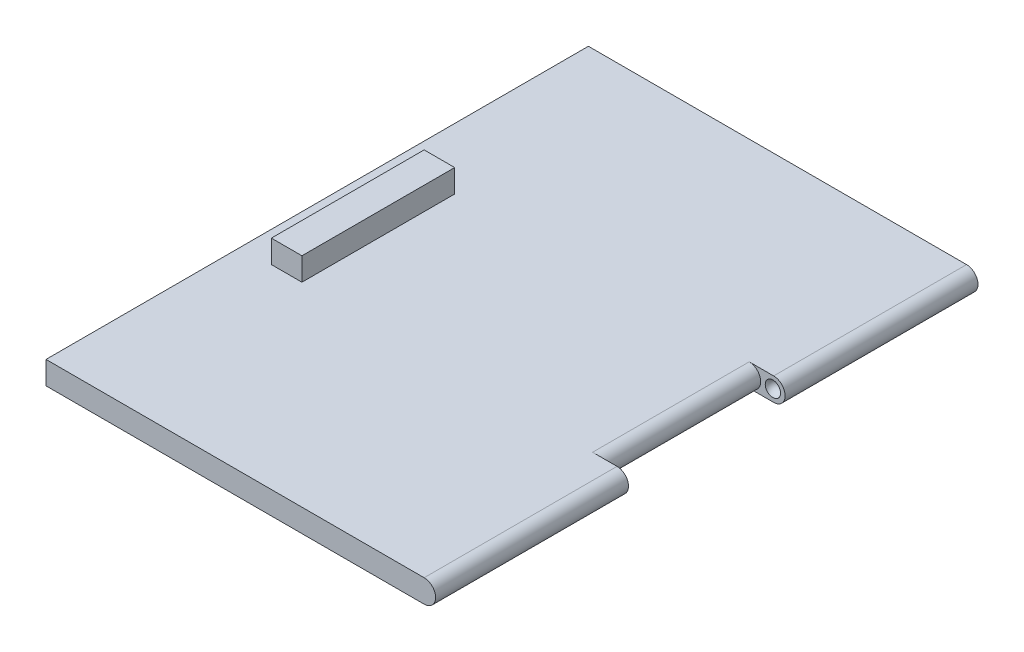
ISO-10303-21;
HEADER;
FILE_DESCRIPTION(('STEP AP214'),'2;1');
FILE_NAME('part.step','',(''),(''),'','','');
FILE_SCHEMA(('AUTOMOTIVE_DESIGN { 1 0 10303 214 1 1 1 1 }'));
ENDSEC;
DATA;
#1=APPLICATION_CONTEXT('core data for automotive mechanical design processes');
#2=APPLICATION_PROTOCOL_DEFINITION('international standard','automotive_design',2000,#1);
#3=PRODUCT_CONTEXT('',#1,'mechanical');
#4=PRODUCT('Part','Part','',(#3));
#5=PRODUCT_RELATED_PRODUCT_CATEGORY('part','',(#4));
#6=PRODUCT_DEFINITION_FORMATION('','',#4);
#7=PRODUCT_DEFINITION_CONTEXT('part definition',#1,'design');
#8=PRODUCT_DEFINITION('design','',#6,#7);
#9=PRODUCT_DEFINITION_SHAPE('','',#8);
#10=(LENGTH_UNIT() NAMED_UNIT(*) SI_UNIT(.MILLI.,.METRE.));
#11=(NAMED_UNIT(*) PLANE_ANGLE_UNIT() SI_UNIT($,.RADIAN.));
#12=(NAMED_UNIT(*) SI_UNIT($,.STERADIAN.) SOLID_ANGLE_UNIT());
#13=UNCERTAINTY_MEASURE_WITH_UNIT(LENGTH_MEASURE(1.E-05),#10,'distance_accuracy_value','');
#14=(GEOMETRIC_REPRESENTATION_CONTEXT(3) GLOBAL_UNCERTAINTY_ASSIGNED_CONTEXT((#13)) GLOBAL_UNIT_ASSIGNED_CONTEXT((#10,
#11,#12)) REPRESENTATION_CONTEXT('',''));
#15=CARTESIAN_POINT('',(0.,0.,0.));
#16=DIRECTION('',(0.,0.,1.));
#17=DIRECTION('',(1.,0.,0.));
#18=AXIS2_PLACEMENT_3D('',#15,#16,#17);
#19=CARTESIAN_POINT('',(24.,1.5,-10.25));
#20=DIRECTION('',(0.,0.,-1.));
#21=DIRECTION('',(-1.,0.,0.));
#22=AXIS2_PLACEMENT_3D('',#19,#20,#21);
#23=CYLINDRICAL_SURFACE('',#22,1.5);
#24=DIRECTION('',(0.,0.,1.));
#25=VECTOR('',#24,1.);
#26=CARTESIAN_POINT('',(24.,3.,-10.25));
#27=LINE('',#26,#25);
#28=CARTESIAN_POINT('',(24.,3.,-10.25));
#29=VERTEX_POINT('',#28);
#30=CARTESIAN_POINT('',(24.,3.,-35.5));
#31=VERTEX_POINT('',#30);
#32=EDGE_CURVE('E243',#29,#31,#27,.F.);
#33=ORIENTED_EDGE('',*,*,#32,.F.);
#34=CARTESIAN_POINT('',(24.,1.5,-10.25));
#35=DIRECTION('',(0.,0.,-1.));
#36=DIRECTION('',(-1.,0.,0.));
#37=AXIS2_PLACEMENT_3D('',#34,#35,#36);
#38=CIRCLE('',#37,1.5);
#39=CARTESIAN_POINT('',(24.,0.,-10.25));
#40=VERTEX_POINT('',#39);
#41=EDGE_CURVE('E56',#40,#29,#38,.F.);
#42=ORIENTED_EDGE('',*,*,#41,.F.);
#43=DIRECTION('',(0.,0.,-1.));
#44=VECTOR('',#43,1.);
#45=CARTESIAN_POINT('',(24.,0.,0.));
#46=LINE('',#45,#44);
#47=CARTESIAN_POINT('',(24.,0.,-35.5));
#48=VERTEX_POINT('',#47);
#49=EDGE_CURVE('E247',#48,#40,#46,.F.);
#50=ORIENTED_EDGE('',*,*,#49,.F.);
#51=CARTESIAN_POINT('',(24.,1.5,-35.5));
#52=DIRECTION('',(0.,0.,1.));
#53=DIRECTION('',(1.,0.,0.));
#54=AXIS2_PLACEMENT_3D('',#51,#52,#53);
#55=CIRCLE('',#54,1.5);
#56=EDGE_CURVE('E11',#31,#48,#55,.F.);
#57=ORIENTED_EDGE('',*,*,#56,.F.);
#58=EDGE_LOOP('',(#33,#42,#50,#57));
#59=FACE_BOUND('',#58,.T.);
#60=ADVANCED_FACE('F47',(#59),#23,.T.);
#61=CARTESIAN_POINT('',(20.8,1.5,30.75));
#62=DIRECTION('',(0.,0.,1.));
#63=DIRECTION('',(1.,0.,0.));
#64=AXIS2_PLACEMENT_3D('',#61,#62,#63);
#65=CYLINDRICAL_SURFACE('',#64,1.5);
#66=DIRECTION('',(0.,0.,-1.));
#67=VECTOR('',#66,1.);
#68=CARTESIAN_POINT('',(20.8,3.,30.75));
#69=LINE('',#68,#67);
#70=CARTESIAN_POINT('',(20.8,3.,10.25));
#71=VERTEX_POINT('',#70);
#72=CARTESIAN_POINT('',(20.8,3.,-10.25));
#73=VERTEX_POINT('',#72);
#74=EDGE_CURVE('E227',#71,#73,#69,.T.);
#75=ORIENTED_EDGE('',*,*,#74,.F.);
#76=CARTESIAN_POINT('',(20.8,1.5,10.25));
#77=DIRECTION('',(0.,0.,1.));
#78=DIRECTION('',(1.,0.,0.));
#79=AXIS2_PLACEMENT_3D('',#76,#77,#78);
#80=CIRCLE('',#79,1.5);
#81=CARTESIAN_POINT('',(20.8,0.,10.25));
#82=VERTEX_POINT('',#81);
#83=EDGE_CURVE('E239',#82,#71,#80,.T.);
#84=ORIENTED_EDGE('',*,*,#83,.F.);
#85=DIRECTION('',(0.,0.,1.));
#86=VECTOR('',#85,1.);
#87=CARTESIAN_POINT('',(20.8,0.,0.));
#88=LINE('',#87,#86);
#89=CARTESIAN_POINT('',(20.8,0.,-10.25));
#90=VERTEX_POINT('',#89);
#91=EDGE_CURVE('E231',#90,#82,#88,.T.);
#92=ORIENTED_EDGE('',*,*,#91,.F.);
#93=CARTESIAN_POINT('',(20.8,1.5,-10.25));
#94=DIRECTION('',(0.,0.,-1.));
#95=DIRECTION('',(-1.,0.,0.));
#96=AXIS2_PLACEMENT_3D('',#93,#94,#95);
#97=CIRCLE('',#96,1.5);
#98=EDGE_CURVE('E235',#73,#90,#97,.T.);
#99=ORIENTED_EDGE('',*,*,#98,.F.);
#100=EDGE_LOOP('',(#75,#84,#92,#99));
#101=FACE_BOUND('',#100,.T.);
#102=ADVANCED_FACE('F302',(#101),#65,.T.);
#103=CARTESIAN_POINT('',(24.,1.5,35.5));
#104=DIRECTION('',(0.,0.,-1.));
#105=DIRECTION('',(-1.,0.,0.));
#106=AXIS2_PLACEMENT_3D('',#103,#104,#105);
#107=CYLINDRICAL_SURFACE('',#106,1.5);
#108=DIRECTION('',(0.,0.,1.));
#109=VECTOR('',#108,1.);
#110=CARTESIAN_POINT('',(24.,3.,35.5));
#111=LINE('',#110,#109);
#112=CARTESIAN_POINT('',(24.,3.,35.5));
#113=VERTEX_POINT('',#112);
#114=CARTESIAN_POINT('',(24.,3.,10.25));
#115=VERTEX_POINT('',#114);
#116=EDGE_CURVE('E203',#113,#115,#111,.F.);
#117=ORIENTED_EDGE('',*,*,#116,.F.);
#118=CARTESIAN_POINT('',(24.,1.5,35.5));
#119=DIRECTION('',(0.,0.,-1.));
#120=DIRECTION('',(-1.,0.,0.));
#121=AXIS2_PLACEMENT_3D('',#118,#119,#120);
#122=CIRCLE('',#121,1.5);
#123=CARTESIAN_POINT('',(24.,0.,35.5));
#124=VERTEX_POINT('',#123);
#125=EDGE_CURVE('E224',#124,#113,#122,.F.);
#126=ORIENTED_EDGE('',*,*,#125,.F.);
#127=DIRECTION('',(0.,0.,-1.));
#128=VECTOR('',#127,1.);
#129=CARTESIAN_POINT('',(24.,0.,0.));
#130=LINE('',#129,#128);
#131=CARTESIAN_POINT('',(24.,0.,10.25));
#132=VERTEX_POINT('',#131);
#133=EDGE_CURVE('E220',#132,#124,#130,.F.);
#134=ORIENTED_EDGE('',*,*,#133,.F.);
#135=CARTESIAN_POINT('',(24.,1.5,10.25));
#136=DIRECTION('',(0.,0.,1.));
#137=DIRECTION('',(1.,0.,0.));
#138=AXIS2_PLACEMENT_3D('',#135,#136,#137);
#139=CIRCLE('',#138,1.5);
#140=EDGE_CURVE('E216',#115,#132,#139,.F.);
#141=ORIENTED_EDGE('',*,*,#140,.F.);
#142=EDGE_LOOP('',(#117,#126,#134,#141));
#143=FACE_BOUND('',#142,.T.);
#144=ADVANCED_FACE('F293',(#143),#107,.T.);
#145=CARTESIAN_POINT('',(0.,3.,0.));
#146=DIRECTION('',(0.,1.,0.));
#147=DIRECTION('',(0.,0.,1.));
#148=AXIS2_PLACEMENT_3D('',#145,#146,#147);
#149=PLANE('',#148);
#150=DIRECTION('',(-1.,0.,0.));
#151=VECTOR('',#150,1.);
#152=CARTESIAN_POINT('',(22.3,3.,-10.25));
#153=LINE('',#152,#151);
#154=EDGE_CURVE('E208',#29,#73,#153,.T.);
#155=ORIENTED_EDGE('',*,*,#154,.F.);
#156=ORIENTED_EDGE('',*,*,#32,.T.);
#157=DIRECTION('',(-1.,0.,0.));
#158=VECTOR('',#157,1.);
#159=CARTESIAN_POINT('',(-25.5,3.,-35.5));
#160=LINE('',#159,#158);
#161=CARTESIAN_POINT('',(-25.5,3.,-35.5));
#162=VERTEX_POINT('',#161);
#163=EDGE_CURVE('E172',#31,#162,#160,.T.);
#164=ORIENTED_EDGE('',*,*,#163,.T.);
#165=DIRECTION('',(0.,0.,1.));
#166=VECTOR('',#165,1.);
#167=CARTESIAN_POINT('',(-25.5,3.,-35.5));
#168=LINE('',#167,#166);
#169=CARTESIAN_POINT('',(-25.5,3.,35.5));
#170=VERTEX_POINT('',#169);
#171=EDGE_CURVE('E175',#162,#170,#168,.T.);
#172=ORIENTED_EDGE('',*,*,#171,.T.);
#173=DIRECTION('',(1.,0.,0.));
#174=VECTOR('',#173,1.);
#175=CARTESIAN_POINT('',(-25.5,3.,35.5));
#176=LINE('',#175,#174);
#177=EDGE_CURVE('E179',#170,#113,#176,.T.);
#178=ORIENTED_EDGE('',*,*,#177,.T.);
#179=ORIENTED_EDGE('',*,*,#116,.T.);
#180=DIRECTION('',(1.,0.,0.));
#181=VECTOR('',#180,1.);
#182=CARTESIAN_POINT('',(22.3,3.,10.25));
#183=LINE('',#182,#181);
#184=EDGE_CURVE('E260',#71,#115,#183,.T.);
#185=ORIENTED_EDGE('',*,*,#184,.F.);
#186=ORIENTED_EDGE('',*,*,#74,.T.);
#187=EDGE_LOOP('',(#155,#156,#164,#172,#178,#179,#185,#186));
#188=FACE_BOUND('',#187,.T.);
#189=DIRECTION('',(-1.,0.,0.));
#190=VECTOR('',#189,1.);
#191=CARTESIAN_POINT('',(-21.5,3.,-10.));
#192=LINE('',#191,#190);
#193=CARTESIAN_POINT('',(-17.5,3.,-10.));
#194=VERTEX_POINT('',#193);
#195=CARTESIAN_POINT('',(-21.5,3.,-10.));
#196=VERTEX_POINT('',#195);
#197=EDGE_CURVE('E273',#194,#196,#192,.T.);
#198=ORIENTED_EDGE('',*,*,#197,.F.);
#199=DIRECTION('',(0.,0.,-1.));
#200=VECTOR('',#199,1.);
#201=CARTESIAN_POINT('',(-17.5,3.,-10.));
#202=LINE('',#201,#200);
#203=CARTESIAN_POINT('',(-17.5,3.,10.));
#204=VERTEX_POINT('',#203);
#205=EDGE_CURVE('E159',#204,#194,#202,.T.);
#206=ORIENTED_EDGE('',*,*,#205,.F.);
#207=DIRECTION('',(1.,0.,0.));
#208=VECTOR('',#207,1.);
#209=CARTESIAN_POINT('',(-21.5,3.,10.));
#210=LINE('',#209,#208);
#211=CARTESIAN_POINT('',(-21.5,3.,10.));
#212=VERTEX_POINT('',#211);
#213=EDGE_CURVE('E155',#212,#204,#210,.T.);
#214=ORIENTED_EDGE('',*,*,#213,.F.);
#215=DIRECTION('',(0.,0.,1.));
#216=VECTOR('',#215,1.);
#217=CARTESIAN_POINT('',(-21.5,3.,-10.));
#218=LINE('',#217,#216);
#219=EDGE_CURVE('E276',#196,#212,#218,.T.);
#220=ORIENTED_EDGE('',*,*,#219,.F.);
#221=EDGE_LOOP('',(#198,#206,#214,#220));
#222=FACE_BOUND('',#221,.T.);
#223=ADVANCED_FACE('F256',(#188,#222),#149,.T.);
#224=CARTESIAN_POINT('',(-25.5,3.,-35.5));
#225=DIRECTION('',(0.,0.,1.));
#226=DIRECTION('',(1.,0.,0.));
#227=AXIS2_PLACEMENT_3D('',#224,#225,#226);
#228=PLANE('',#227);
#229=ORIENTED_EDGE('',*,*,#163,.F.);
#230=ORIENTED_EDGE('',*,*,#56,.T.);
#231=DIRECTION('',(-1.,0.,0.));
#232=VECTOR('',#231,1.);
#233=CARTESIAN_POINT('',(-25.5,0.,-35.5));
#234=LINE('',#233,#232);
#235=CARTESIAN_POINT('',(-25.5,0.,-35.5));
#236=VERTEX_POINT('',#235);
#237=EDGE_CURVE('E162',#48,#236,#234,.T.);
#238=ORIENTED_EDGE('',*,*,#237,.T.);
#239=DIRECTION('',(0.,-1.,0.));
#240=VECTOR('',#239,1.);
#241=CARTESIAN_POINT('',(-25.5,3.,-35.5));
#242=LINE('',#241,#240);
#243=EDGE_CURVE('E192',#162,#236,#242,.T.);
#244=ORIENTED_EDGE('',*,*,#243,.F.);
#245=EDGE_LOOP('',(#229,#230,#238,#244));
#246=FACE_BOUND('',#245,.T.);
#247=ADVANCED_FACE('F292',(#246),#228,.F.);
#248=CARTESIAN_POINT('',(-25.5,3.,-35.5));
#249=DIRECTION('',(1.,0.,0.));
#250=DIRECTION('',(0.,0.,-1.));
#251=AXIS2_PLACEMENT_3D('',#248,#249,#250);
#252=PLANE('',#251);
#253=DIRECTION('',(0.,0.,1.));
#254=VECTOR('',#253,1.);
#255=CARTESIAN_POINT('',(-25.5,0.,-35.5));
#256=LINE('',#255,#254);
#257=CARTESIAN_POINT('',(-25.5,0.,35.5));
#258=VERTEX_POINT('',#257);
#259=EDGE_CURVE('E166',#236,#258,#256,.T.);
#260=ORIENTED_EDGE('',*,*,#259,.T.);
#261=DIRECTION('',(0.,-1.,0.));
#262=VECTOR('',#261,1.);
#263=CARTESIAN_POINT('',(-25.5,3.,35.5));
#264=LINE('',#263,#262);
#265=EDGE_CURVE('E182',#170,#258,#264,.T.);
#266=ORIENTED_EDGE('',*,*,#265,.F.);
#267=ORIENTED_EDGE('',*,*,#171,.F.);
#268=ORIENTED_EDGE('',*,*,#243,.T.);
#269=EDGE_LOOP('',(#260,#266,#267,#268));
#270=FACE_BOUND('',#269,.T.);
#271=ADVANCED_FACE('F299',(#270),#252,.F.);
#272=CARTESIAN_POINT('',(-25.5,3.,35.5));
#273=DIRECTION('',(0.,0.,-1.));
#274=DIRECTION('',(-1.,0.,0.));
#275=AXIS2_PLACEMENT_3D('',#272,#273,#274);
#276=PLANE('',#275);
#277=DIRECTION('',(1.,0.,0.));
#278=VECTOR('',#277,1.);
#279=CARTESIAN_POINT('',(-25.5,0.,35.5));
#280=LINE('',#279,#278);
#281=EDGE_CURVE('E176',#258,#124,#280,.T.);
#282=ORIENTED_EDGE('',*,*,#281,.T.);
#283=ORIENTED_EDGE('',*,*,#125,.T.);
#284=ORIENTED_EDGE('',*,*,#177,.F.);
#285=ORIENTED_EDGE('',*,*,#265,.T.);
#286=EDGE_LOOP('',(#282,#283,#284,#285));
#287=FACE_BOUND('',#286,.T.);
#288=ADVANCED_FACE('F324',(#287),#276,.F.);
#289=CARTESIAN_POINT('',(0.,0.,0.));
#290=DIRECTION('',(0.,1.,0.));
#291=DIRECTION('',(0.,0.,1.));
#292=AXIS2_PLACEMENT_3D('',#289,#290,#291);
#293=PLANE('',#292);
#294=ORIENTED_EDGE('',*,*,#237,.F.);
#295=ORIENTED_EDGE('',*,*,#49,.T.);
#296=DIRECTION('',(-1.,0.,0.));
#297=VECTOR('',#296,1.);
#298=CARTESIAN_POINT('',(0.,0.,-10.25));
#299=LINE('',#298,#297);
#300=EDGE_CURVE('E196',#40,#90,#299,.T.);
#301=ORIENTED_EDGE('',*,*,#300,.T.);
#302=ORIENTED_EDGE('',*,*,#91,.T.);
#303=DIRECTION('',(1.,0.,0.));
#304=VECTOR('',#303,1.);
#305=CARTESIAN_POINT('',(0.,0.,10.25));
#306=LINE('',#305,#304);
#307=EDGE_CURVE('E199',#82,#132,#306,.T.);
#308=ORIENTED_EDGE('',*,*,#307,.T.);
#309=ORIENTED_EDGE('',*,*,#133,.T.);
#310=ORIENTED_EDGE('',*,*,#281,.F.);
#311=ORIENTED_EDGE('',*,*,#259,.F.);
#312=EDGE_LOOP('',(#294,#295,#301,#302,#308,#309,#310,#311));
#313=FACE_BOUND('',#312,.T.);
#314=ADVANCED_FACE('F326',(#313),#293,.F.);
#315=CARTESIAN_POINT('',(-17.5,6.,-10.));
#316=DIRECTION('',(-1.,0.,0.));
#317=DIRECTION('',(0.,0.,1.));
#318=AXIS2_PLACEMENT_3D('',#315,#316,#317);
#319=PLANE('',#318);
#320=ORIENTED_EDGE('',*,*,#205,.T.);
#321=DIRECTION('',(0.,-1.,0.));
#322=VECTOR('',#321,1.);
#323=CARTESIAN_POINT('',(-17.5,6.,-10.));
#324=LINE('',#323,#322);
#325=CARTESIAN_POINT('',(-17.5,6.,-10.));
#326=VERTEX_POINT('',#325);
#327=EDGE_CURVE('E137',#326,#194,#324,.T.);
#328=ORIENTED_EDGE('',*,*,#327,.F.);
#329=DIRECTION('',(0.,0.,-1.));
#330=VECTOR('',#329,1.);
#331=CARTESIAN_POINT('',(-17.5,6.,-10.));
#332=LINE('',#331,#330);
#333=CARTESIAN_POINT('',(-17.5,6.,10.));
#334=VERTEX_POINT('',#333);
#335=EDGE_CURVE('E145',#334,#326,#332,.T.);
#336=ORIENTED_EDGE('',*,*,#335,.F.);
#337=DIRECTION('',(0.,-1.,0.));
#338=VECTOR('',#337,1.);
#339=CARTESIAN_POINT('',(-17.5,6.,10.));
#340=LINE('',#339,#338);
#341=EDGE_CURVE('E270',#334,#204,#340,.T.);
#342=ORIENTED_EDGE('',*,*,#341,.T.);
#343=EDGE_LOOP('',(#320,#328,#336,#342));
#344=FACE_BOUND('',#343,.T.);
#345=ADVANCED_FACE('F157',(#344),#319,.F.);
#346=CARTESIAN_POINT('',(-21.5,6.,-10.));
#347=DIRECTION('',(0.,0.,1.));
#348=DIRECTION('',(1.,0.,0.));
#349=AXIS2_PLACEMENT_3D('',#346,#347,#348);
#350=PLANE('',#349);
#351=ORIENTED_EDGE('',*,*,#197,.T.);
#352=DIRECTION('',(0.,-1.,0.));
#353=VECTOR('',#352,1.);
#354=CARTESIAN_POINT('',(-21.5,6.,-10.));
#355=LINE('',#354,#353);
#356=CARTESIAN_POINT('',(-21.5,6.,-10.));
#357=VERTEX_POINT('',#356);
#358=EDGE_CURVE('E140',#357,#196,#355,.T.);
#359=ORIENTED_EDGE('',*,*,#358,.F.);
#360=DIRECTION('',(-1.,0.,0.));
#361=VECTOR('',#360,1.);
#362=CARTESIAN_POINT('',(-21.5,6.,-10.));
#363=LINE('',#362,#361);
#364=EDGE_CURVE('E133',#326,#357,#363,.T.);
#365=ORIENTED_EDGE('',*,*,#364,.F.);
#366=ORIENTED_EDGE('',*,*,#327,.T.);
#367=EDGE_LOOP('',(#351,#359,#365,#366));
#368=FACE_BOUND('',#367,.T.);
#369=ADVANCED_FACE('F135',(#368),#350,.F.);
#370=CARTESIAN_POINT('',(-21.5,6.,-10.));
#371=DIRECTION('',(1.,0.,0.));
#372=DIRECTION('',(0.,0.,-1.));
#373=AXIS2_PLACEMENT_3D('',#370,#371,#372);
#374=PLANE('',#373);
#375=ORIENTED_EDGE('',*,*,#219,.T.);
#376=DIRECTION('',(0.,-1.,0.));
#377=VECTOR('',#376,1.);
#378=CARTESIAN_POINT('',(-21.5,6.,10.));
#379=LINE('',#378,#377);
#380=CARTESIAN_POINT('',(-21.5,6.,10.));
#381=VERTEX_POINT('',#380);
#382=EDGE_CURVE('E168',#381,#212,#379,.T.);
#383=ORIENTED_EDGE('',*,*,#382,.F.);
#384=DIRECTION('',(0.,0.,1.));
#385=VECTOR('',#384,1.);
#386=CARTESIAN_POINT('',(-21.5,6.,-10.));
#387=LINE('',#386,#385);
#388=EDGE_CURVE('E144',#357,#381,#387,.T.);
#389=ORIENTED_EDGE('',*,*,#388,.F.);
#390=ORIENTED_EDGE('',*,*,#358,.T.);
#391=EDGE_LOOP('',(#375,#383,#389,#390));
#392=FACE_BOUND('',#391,.T.);
#393=ADVANCED_FACE('F290',(#392),#374,.F.);
#394=CARTESIAN_POINT('',(-21.5,6.,10.));
#395=DIRECTION('',(0.,0.,-1.));
#396=DIRECTION('',(-1.,0.,0.));
#397=AXIS2_PLACEMENT_3D('',#394,#395,#396);
#398=PLANE('',#397);
#399=ORIENTED_EDGE('',*,*,#213,.T.);
#400=ORIENTED_EDGE('',*,*,#341,.F.);
#401=DIRECTION('',(1.,0.,0.));
#402=VECTOR('',#401,1.);
#403=CARTESIAN_POINT('',(-21.5,6.,10.));
#404=LINE('',#403,#402);
#405=EDGE_CURVE('E150',#381,#334,#404,.T.);
#406=ORIENTED_EDGE('',*,*,#405,.F.);
#407=ORIENTED_EDGE('',*,*,#382,.T.);
#408=EDGE_LOOP('',(#399,#400,#406,#407));
#409=FACE_BOUND('',#408,.T.);
#410=ADVANCED_FACE('F286',(#409),#398,.F.);
#411=CARTESIAN_POINT('',(0.,6.,0.));
#412=DIRECTION('',(0.,1.,0.));
#413=DIRECTION('',(0.,0.,1.));
#414=AXIS2_PLACEMENT_3D('',#411,#412,#413);
#415=PLANE('',#414);
#416=ORIENTED_EDGE('',*,*,#335,.T.);
#417=ORIENTED_EDGE('',*,*,#364,.T.);
#418=ORIENTED_EDGE('',*,*,#388,.T.);
#419=ORIENTED_EDGE('',*,*,#405,.T.);
#420=EDGE_LOOP('',(#416,#417,#418,#419));
#421=FACE_BOUND('',#420,.T.);
#422=ADVANCED_FACE('F148',(#421),#415,.T.);
#423=CARTESIAN_POINT('',(22.3,-2.,10.25));
#424=DIRECTION('',(0.,0.,1.));
#425=DIRECTION('',(1.,0.,0.));
#426=AXIS2_PLACEMENT_3D('',#423,#424,#425);
#427=PLANE('',#426);
#428=CARTESIAN_POINT('',(23.9,1.5,10.25));
#429=DIRECTION('',(0.,0.,1.));
#430=DIRECTION('',(1.,0.,0.));
#431=AXIS2_PLACEMENT_3D('',#428,#429,#430);
#432=CIRCLE('',#431,0.999999969953078);
#433=CARTESIAN_POINT('',(24.8999999699531,1.5,10.25));
#434=VERTEX_POINT('',#433);
#435=EDGE_CURVE('E209',#434,#434,#432,.T.);
#436=ORIENTED_EDGE('',*,*,#435,.T.);
#437=EDGE_LOOP('',(#436));
#438=FACE_BOUND('',#437,.T.);
#439=ORIENTED_EDGE('',*,*,#184,.T.);
#440=ORIENTED_EDGE('',*,*,#140,.T.);
#441=ORIENTED_EDGE('',*,*,#307,.F.);
#442=ORIENTED_EDGE('',*,*,#83,.T.);
#443=EDGE_LOOP('',(#439,#440,#441,#442));
#444=FACE_BOUND('',#443,.T.);
#445=ADVANCED_FACE('F343',(#438,#444),#427,.F.);
#446=CARTESIAN_POINT('',(22.3,-2.,-10.25));
#447=DIRECTION('',(0.,0.,-1.));
#448=DIRECTION('',(-1.,0.,0.));
#449=AXIS2_PLACEMENT_3D('',#446,#447,#448);
#450=PLANE('',#449);
#451=CARTESIAN_POINT('',(23.9,1.5,-10.25));
#452=DIRECTION('',(0.,0.,-1.));
#453=DIRECTION('',(-1.,0.,0.));
#454=AXIS2_PLACEMENT_3D('',#451,#452,#453);
#455=CIRCLE('',#454,0.999999969953078);
#456=CARTESIAN_POINT('',(22.9000000300469,1.5,-10.25));
#457=VERTEX_POINT('',#456);
#458=EDGE_CURVE('E204',#457,#457,#455,.T.);
#459=ORIENTED_EDGE('',*,*,#458,.T.);
#460=EDGE_LOOP('',(#459));
#461=FACE_BOUND('',#460,.T.);
#462=ORIENTED_EDGE('',*,*,#300,.F.);
#463=ORIENTED_EDGE('',*,*,#41,.T.);
#464=ORIENTED_EDGE('',*,*,#154,.T.);
#465=ORIENTED_EDGE('',*,*,#98,.T.);
#466=EDGE_LOOP('',(#462,#463,#464,#465));
#467=FACE_BOUND('',#466,.T.);
#468=ADVANCED_FACE('F252',(#461,#467),#450,.F.);
#469=CARTESIAN_POINT('',(23.9,1.5,-10.25));
#470=DIRECTION('',(-1.,0.,0.));
#471=DIRECTION('',(0.,1.,0.));
#472=AXIS2_PLACEMENT_3D('',#469,#470,#471);
#473=SPHERICAL_SURFACE('',#472,0.999999969953078);
#474=CARTESIAN_POINT('',(23.9,1.5,-10.25));
#475=DIRECTION('',(0.,0.,-1.));
#476=DIRECTION('',(-1.,0.,0.));
#477=AXIS2_PLACEMENT_3D('',#474,#475,#476);
#478=SPHERICAL_SURFACE('',#477,0.999999969953078);
#479=ORIENTED_EDGE('',*,*,#458,.F.);
#480=EDGE_LOOP('',(#479));
#481=FACE_BOUND('',#480,.T.);
#482=ADVANCED_FACE('F350',(#481),#478,.F.);
#483=CARTESIAN_POINT('',(23.9,1.5,10.25));
#484=DIRECTION('',(-1.,0.,0.));
#485=DIRECTION('',(0.,1.,0.));
#486=AXIS2_PLACEMENT_3D('',#483,#484,#485);
#487=SPHERICAL_SURFACE('',#486,0.999999969953078);
#488=CARTESIAN_POINT('',(23.9,1.5,10.25));
#489=DIRECTION('',(0.,0.,1.));
#490=DIRECTION('',(1.,0.,0.));
#491=AXIS2_PLACEMENT_3D('',#488,#489,#490);
#492=SPHERICAL_SURFACE('',#491,0.999999969953078);
#493=ORIENTED_EDGE('',*,*,#435,.F.);
#494=EDGE_LOOP('',(#493));
#495=FACE_BOUND('',#494,.T.);
#496=ADVANCED_FACE('F389',(#495),#492,.F.);
#497=CLOSED_SHELL('',(#60,#102,#144,#223,#247,#271,#288,#314,#345,#369,#393,#410,#422,#445,#468,
#482,#496));
#498=MANIFOLD_SOLID_BREP('B2',#497);
#499=ADVANCED_BREP_SHAPE_REPRESENTATION('',(#18,#498),#14);
#500=SHAPE_DEFINITION_REPRESENTATION(#9,#499);
ENDSEC;
END-ISO-10303-21;
